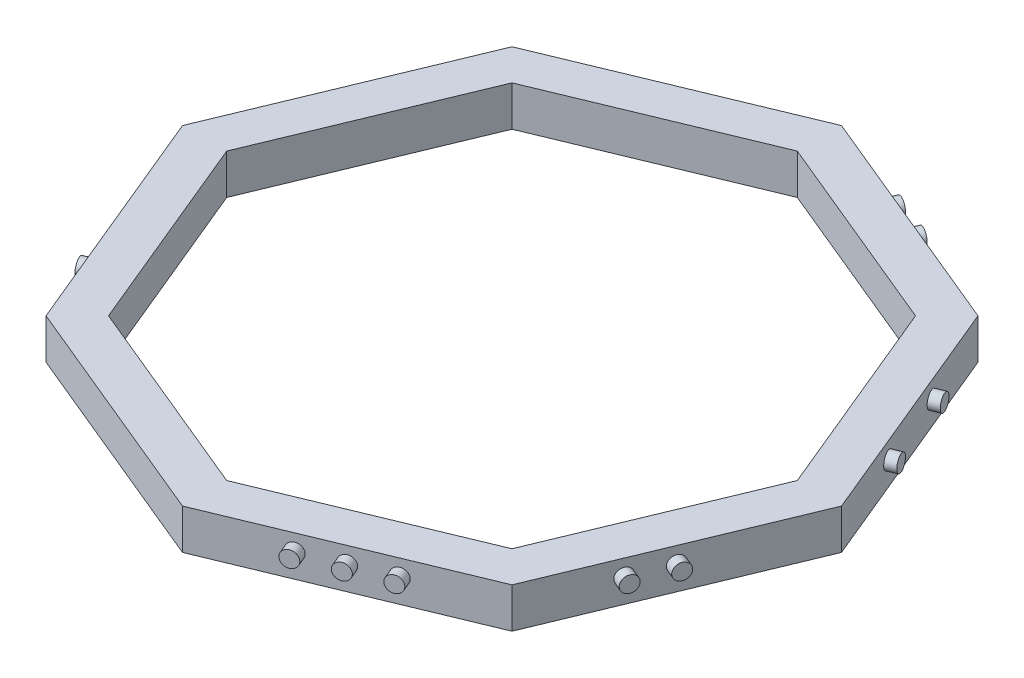
ISO-10303-21;
HEADER;
FILE_DESCRIPTION(('STEP AP214'),'2;1');
FILE_NAME('part.step','',(''),(''),'','','');
FILE_SCHEMA(('AUTOMOTIVE_DESIGN { 1 0 10303 214 1 1 1 1 }'));
ENDSEC;
DATA;
#1=APPLICATION_CONTEXT('core data for automotive mechanical design processes');
#2=APPLICATION_PROTOCOL_DEFINITION('international standard','automotive_design',2000,#1);
#3=PRODUCT_CONTEXT('',#1,'mechanical');
#4=PRODUCT('Part','Part','',(#3));
#5=PRODUCT_RELATED_PRODUCT_CATEGORY('part','',(#4));
#6=PRODUCT_DEFINITION_FORMATION('','',#4);
#7=PRODUCT_DEFINITION_CONTEXT('part definition',#1,'design');
#8=PRODUCT_DEFINITION('design','',#6,#7);
#9=PRODUCT_DEFINITION_SHAPE('','',#8);
#10=(LENGTH_UNIT() NAMED_UNIT(*) SI_UNIT(.MILLI.,.METRE.));
#11=(NAMED_UNIT(*) PLANE_ANGLE_UNIT() SI_UNIT($,.RADIAN.));
#12=(NAMED_UNIT(*) SI_UNIT($,.STERADIAN.) SOLID_ANGLE_UNIT());
#13=UNCERTAINTY_MEASURE_WITH_UNIT(LENGTH_MEASURE(1.E-05),#10,'distance_accuracy_value','');
#14=(GEOMETRIC_REPRESENTATION_CONTEXT(3) GLOBAL_UNCERTAINTY_ASSIGNED_CONTEXT((#13)) GLOBAL_UNIT_ASSIGNED_CONTEXT((#10,
#11,#12)) REPRESENTATION_CONTEXT('',''));
#15=CARTESIAN_POINT('',(0.,0.,0.));
#16=DIRECTION('',(0.,0.,1.));
#17=DIRECTION('',(1.,0.,0.));
#18=AXIS2_PLACEMENT_3D('',#15,#16,#17);
#19=CARTESIAN_POINT('',(28.9913780286488,5.,28.9913780286481));
#20=DIRECTION('',(-0.923879532511291,0.,-0.38268343236508));
#21=DIRECTION('',(-0.38268343236508,0.,0.923879532511291));
#22=AXIS2_PLACEMENT_3D('',#19,#20,#21);
#23=PLANE('',#22);
#24=CARTESIAN_POINT('',(34.9956890143244,3.,14.4956890143238));
#25=DIRECTION('',(-0.923879532511291,0.,-0.38268343236508));
#26=DIRECTION('',(-0.38268343236508,0.,0.923879532511291));
#27=AXIS2_PLACEMENT_3D('',#24,#25,#26);
#28=CIRCLE('',#27,1.);
#29=CARTESIAN_POINT('',(34.6130055819593,3.,15.4195685468351));
#30=VERTEX_POINT('',#29);
#31=EDGE_CURVE('E11',#30,#30,#28,.F.);
#32=ORIENTED_EDGE('',*,*,#31,.F.);
#33=EDGE_LOOP('',(#32));
#34=FACE_BOUND('',#33,.T.);
#35=CARTESIAN_POINT('',(33.082271852499,3.,19.1150866768803));
#36=DIRECTION('',(-0.923879532511291,0.,-0.38268343236508));
#37=DIRECTION('',(-0.38268343236508,0.,0.923879532511291));
#38=AXIS2_PLACEMENT_3D('',#35,#36,#37);
#39=CIRCLE('',#38,1.);
#40=CARTESIAN_POINT('',(32.6995884201339,3.,20.0389662093916));
#41=VERTEX_POINT('',#40);
#42=EDGE_CURVE('E40',#41,#41,#39,.F.);
#43=ORIENTED_EDGE('',*,*,#42,.F.);
#44=EDGE_LOOP('',(#43));
#45=FACE_BOUND('',#44,.T.);
#46=DIRECTION('',(0.38268343236508,0.,-0.923879532511291));
#47=VECTOR('',#46,1.);
#48=CARTESIAN_POINT('',(28.9913780286488,0.,28.9913780286481));
#49=LINE('',#48,#47);
#50=CARTESIAN_POINT('',(28.9913780286488,0.,28.9913780286481));
#51=VERTEX_POINT('',#50);
#52=CARTESIAN_POINT('',(41.,0.,-4.48023070960939E-13));
#53=VERTEX_POINT('',#52);
#54=EDGE_CURVE('E205',#51,#53,#49,.T.);
#55=ORIENTED_EDGE('',*,*,#54,.T.);
#56=DIRECTION('',(0.,-1.,0.));
#57=VECTOR('',#56,1.);
#58=CARTESIAN_POINT('',(41.,5.,-4.48023070960939E-13));
#59=LINE('',#58,#57);
#60=CARTESIAN_POINT('',(41.,5.,-4.48023070960939E-13));
#61=VERTEX_POINT('',#60);
#62=EDGE_CURVE('E271',#61,#53,#59,.T.);
#63=ORIENTED_EDGE('',*,*,#62,.F.);
#64=DIRECTION('',(0.38268343236508,0.,-0.923879532511291));
#65=VECTOR('',#64,1.);
#66=CARTESIAN_POINT('',(28.9913780286488,5.,28.9913780286481));
#67=LINE('',#66,#65);
#68=CARTESIAN_POINT('',(28.9913780286488,5.,28.9913780286481));
#69=VERTEX_POINT('',#68);
#70=EDGE_CURVE('E217',#69,#61,#67,.T.);
#71=ORIENTED_EDGE('',*,*,#70,.F.);
#72=DIRECTION('',(0.,-1.,0.));
#73=VECTOR('',#72,1.);
#74=CARTESIAN_POINT('',(28.9913780286488,5.,28.9913780286481));
#75=LINE('',#74,#73);
#76=EDGE_CURVE('E235',#69,#51,#75,.T.);
#77=ORIENTED_EDGE('',*,*,#76,.T.);
#78=EDGE_LOOP('',(#55,#63,#71,#77));
#79=FACE_BOUND('',#78,.T.);
#80=ADVANCED_FACE('F33',(#34,#45,#79),#23,.F.);
#81=CARTESIAN_POINT('',(41.,5.,-4.48023070960939E-13));
#82=DIRECTION('',(-0.923879532511283,0.,0.3826834323651));
#83=DIRECTION('',(0.3826834323651,0.,0.923879532511283));
#84=AXIS2_PLACEMENT_3D('',#81,#82,#83);
#85=PLANE('',#84);
#86=CARTESIAN_POINT('',(33.0822718524986,3.,-19.115086676881));
#87=DIRECTION('',(-0.923879532511283,0.,0.3826834323651));
#88=DIRECTION('',(0.3826834323651,0.,0.923879532511283));
#89=AXIS2_PLACEMENT_3D('',#86,#87,#88);
#90=CIRCLE('',#89,1.);
#91=CARTESIAN_POINT('',(33.4649552848637,3.,-18.1912071443697));
#92=VERTEX_POINT('',#91);
#93=EDGE_CURVE('E301',#92,#92,#90,.F.);
#94=ORIENTED_EDGE('',*,*,#93,.F.);
#95=EDGE_LOOP('',(#94));
#96=FACE_BOUND('',#95,.T.);
#97=CARTESIAN_POINT('',(36.9091061761496,3.,-9.8762913517682));
#98=DIRECTION('',(-0.923879532511283,0.,0.3826834323651));
#99=DIRECTION('',(0.3826834323651,0.,0.923879532511283));
#100=AXIS2_PLACEMENT_3D('',#97,#98,#99);
#101=CIRCLE('',#100,1.);
#102=CARTESIAN_POINT('',(37.2917896085147,3.,-8.95241181925691));
#103=VERTEX_POINT('',#102);
#104=EDGE_CURVE('E298',#103,#103,#101,.F.);
#105=ORIENTED_EDGE('',*,*,#104,.F.);
#106=EDGE_LOOP('',(#105));
#107=FACE_BOUND('',#106,.T.);
#108=DIRECTION('',(-0.3826834323651,0.,-0.923879532511283));
#109=VECTOR('',#108,1.);
#110=CARTESIAN_POINT('',(41.,0.,-4.48023070960939E-13));
#111=LINE('',#110,#109);
#112=CARTESIAN_POINT('',(28.9913780286481,0.,-28.9913780286488));
#113=VERTEX_POINT('',#112);
#114=EDGE_CURVE('E238',#53,#113,#111,.T.);
#115=ORIENTED_EDGE('',*,*,#114,.T.);
#116=DIRECTION('',(0.,-1.,0.));
#117=VECTOR('',#116,1.);
#118=CARTESIAN_POINT('',(28.9913780286481,5.,-28.9913780286488));
#119=LINE('',#118,#117);
#120=CARTESIAN_POINT('',(28.9913780286481,5.,-28.9913780286488));
#121=VERTEX_POINT('',#120);
#122=EDGE_CURVE('E268',#121,#113,#119,.T.);
#123=ORIENTED_EDGE('',*,*,#122,.F.);
#124=DIRECTION('',(-0.3826834323651,0.,-0.923879532511283));
#125=VECTOR('',#124,1.);
#126=CARTESIAN_POINT('',(41.,5.,-4.48023070960939E-13));
#127=LINE('',#126,#125);
#128=EDGE_CURVE('E220',#61,#121,#127,.T.);
#129=ORIENTED_EDGE('',*,*,#128,.F.);
#130=ORIENTED_EDGE('',*,*,#62,.T.);
#131=EDGE_LOOP('',(#115,#123,#129,#130));
#132=FACE_BOUND('',#131,.T.);
#133=ADVANCED_FACE('F310',(#96,#107,#132),#85,.F.);
#134=CARTESIAN_POINT('',(28.9913780286481,5.,-28.9913780286488));
#135=DIRECTION('',(-0.38268343236508,0.,0.923879532511291));
#136=DIRECTION('',(0.923879532511291,0.,0.38268343236508));
#137=AXIS2_PLACEMENT_3D('',#134,#135,#136);
#138=PLANE('',#137);
#139=CARTESIAN_POINT('',(9.87629135176739,3.,-36.9091061761498));
#140=DIRECTION('',(-0.38268343236508,0.,0.923879532511291));
#141=DIRECTION('',(0.923879532511291,0.,0.38268343236508));
#142=AXIS2_PLACEMENT_3D('',#139,#140,#141);
#143=CIRCLE('',#142,0.999999999999998);
#144=CARTESIAN_POINT('',(10.8001708842787,3.,-36.5264227437847));
#145=VERTEX_POINT('',#144);
#146=EDGE_CURVE('E295',#145,#145,#143,.F.);
#147=ORIENTED_EDGE('',*,*,#146,.F.);
#148=EDGE_LOOP('',(#147));
#149=FACE_BOUND('',#148,.T.);
#150=CARTESIAN_POINT('',(14.4956890143238,3.,-34.9956890143244));
#151=DIRECTION('',(-0.38268343236508,0.,0.923879532511291));
#152=DIRECTION('',(0.923879532511291,0.,0.38268343236508));
#153=AXIS2_PLACEMENT_3D('',#150,#151,#152);
#154=CIRCLE('',#153,1.);
#155=CARTESIAN_POINT('',(15.4195685468351,3.,-34.6130055819593));
#156=VERTEX_POINT('',#155);
#157=EDGE_CURVE('E292',#156,#156,#154,.F.);
#158=ORIENTED_EDGE('',*,*,#157,.F.);
#159=EDGE_LOOP('',(#158));
#160=FACE_BOUND('',#159,.T.);
#161=DIRECTION('',(-0.923879532511291,0.,-0.38268343236508));
#162=VECTOR('',#161,1.);
#163=CARTESIAN_POINT('',(28.9913780286481,0.,-28.9913780286488));
#164=LINE('',#163,#162);
#165=CARTESIAN_POINT('',(-4.51771650624012E-13,0.,-41.));
#166=VERTEX_POINT('',#165);
#167=EDGE_CURVE('E240',#113,#166,#164,.T.);
#168=ORIENTED_EDGE('',*,*,#167,.T.);
#169=DIRECTION('',(0.,-1.,0.));
#170=VECTOR('',#169,1.);
#171=CARTESIAN_POINT('',(-4.51771650624012E-13,5.,-41.));
#172=LINE('',#171,#170);
#173=CARTESIAN_POINT('',(-4.51771650624012E-13,5.,-41.));
#174=VERTEX_POINT('',#173);
#175=EDGE_CURVE('E265',#174,#166,#172,.T.);
#176=ORIENTED_EDGE('',*,*,#175,.F.);
#177=DIRECTION('',(-0.923879532511291,0.,-0.38268343236508));
#178=VECTOR('',#177,1.);
#179=CARTESIAN_POINT('',(28.9913780286481,5.,-28.9913780286488));
#180=LINE('',#179,#178);
#181=EDGE_CURVE('E223',#121,#174,#180,.T.);
#182=ORIENTED_EDGE('',*,*,#181,.F.);
#183=ORIENTED_EDGE('',*,*,#122,.T.);
#184=EDGE_LOOP('',(#168,#176,#182,#183));
#185=FACE_BOUND('',#184,.T.);
#186=ADVANCED_FACE('F348',(#149,#160,#185),#138,.F.);
#187=CARTESIAN_POINT('',(-4.51771650624012E-13,5.,-41.));
#188=DIRECTION('',(0.3826834323651,0.,0.923879532511283));
#189=DIRECTION('',(0.923879532511283,0.,-0.3826834323651));
#190=AXIS2_PLACEMENT_3D('',#187,#188,#189);
#191=PLANE('',#190);
#192=CARTESIAN_POINT('',(-9.8762913517682,3.,-36.9091061761496));
#193=DIRECTION('',(0.3826834323651,0.,0.923879532511283));
#194=DIRECTION('',(0.923879532511283,0.,-0.3826834323651));
#195=AXIS2_PLACEMENT_3D('',#192,#193,#194);
#196=CIRCLE('',#195,1.);
#197=CARTESIAN_POINT('',(-8.95241181925692,3.,-37.2917896085147));
#198=VERTEX_POINT('',#197);
#199=EDGE_CURVE('E289',#198,#198,#196,.F.);
#200=ORIENTED_EDGE('',*,*,#199,.F.);
#201=EDGE_LOOP('',(#200));
#202=FACE_BOUND('',#201,.T.);
#203=DIRECTION('',(-0.923879532511283,0.,0.3826834323651));
#204=VECTOR('',#203,1.);
#205=CARTESIAN_POINT('',(-4.51771650624012E-13,0.,-41.));
#206=LINE('',#205,#204);
#207=CARTESIAN_POINT('',(-28.9913780286488,0.,-28.9913780286481));
#208=VERTEX_POINT('',#207);
#209=EDGE_CURVE('E242',#166,#208,#206,.T.);
#210=ORIENTED_EDGE('',*,*,#209,.T.);
#211=DIRECTION('',(0.,-1.,0.));
#212=VECTOR('',#211,1.);
#213=CARTESIAN_POINT('',(-28.9913780286488,5.,-28.9913780286481));
#214=LINE('',#213,#212);
#215=CARTESIAN_POINT('',(-28.9913780286488,5.,-28.9913780286481));
#216=VERTEX_POINT('',#215);
#217=EDGE_CURVE('E262',#216,#208,#214,.T.);
#218=ORIENTED_EDGE('',*,*,#217,.F.);
#219=DIRECTION('',(-0.923879532511283,0.,0.3826834323651));
#220=VECTOR('',#219,1.);
#221=CARTESIAN_POINT('',(-4.51771650624012E-13,5.,-41.));
#222=LINE('',#221,#220);
#223=EDGE_CURVE('E225',#174,#216,#222,.T.);
#224=ORIENTED_EDGE('',*,*,#223,.F.);
#225=ORIENTED_EDGE('',*,*,#175,.T.);
#226=EDGE_LOOP('',(#210,#218,#224,#225));
#227=FACE_BOUND('',#226,.T.);
#228=ADVANCED_FACE('F345',(#202,#227),#191,.F.);
#229=CARTESIAN_POINT('',(-28.9913780286488,5.,-28.9913780286481));
#230=DIRECTION('',(0.923879532511291,0.,0.38268343236508));
#231=DIRECTION('',(0.38268343236508,0.,-0.923879532511291));
#232=AXIS2_PLACEMENT_3D('',#229,#230,#231);
#233=PLANE('',#232);
#234=CARTESIAN_POINT('',(-34.9956890143244,3.,-14.4956890143239));
#235=DIRECTION('',(0.923879532511291,0.,0.38268343236508));
#236=DIRECTION('',(0.38268343236508,0.,-0.923879532511291));
#237=AXIS2_PLACEMENT_3D('',#234,#235,#236);
#238=CIRCLE('',#237,0.999999999999998);
#239=CARTESIAN_POINT('',(-34.6130055819593,3.,-15.4195685468351));
#240=VERTEX_POINT('',#239);
#241=EDGE_CURVE('E286',#240,#240,#238,.F.);
#242=ORIENTED_EDGE('',*,*,#241,.F.);
#243=EDGE_LOOP('',(#242));
#244=FACE_BOUND('',#243,.T.);
#245=DIRECTION('',(-0.38268343236508,0.,0.923879532511291));
#246=VECTOR('',#245,1.);
#247=CARTESIAN_POINT('',(-28.9913780286488,0.,-28.9913780286481));
#248=LINE('',#247,#246);
#249=CARTESIAN_POINT('',(-41.,0.,4.3736829323662E-13));
#250=VERTEX_POINT('',#249);
#251=EDGE_CURVE('E244',#208,#250,#248,.T.);
#252=ORIENTED_EDGE('',*,*,#251,.T.);
#253=DIRECTION('',(0.,-1.,0.));
#254=VECTOR('',#253,1.);
#255=CARTESIAN_POINT('',(-41.,5.,4.3736829323662E-13));
#256=LINE('',#255,#254);
#257=CARTESIAN_POINT('',(-41.,5.,4.3736829323662E-13));
#258=VERTEX_POINT('',#257);
#259=EDGE_CURVE('E259',#258,#250,#256,.T.);
#260=ORIENTED_EDGE('',*,*,#259,.F.);
#261=DIRECTION('',(-0.38268343236508,0.,0.923879532511291));
#262=VECTOR('',#261,1.);
#263=CARTESIAN_POINT('',(-28.9913780286488,5.,-28.9913780286481));
#264=LINE('',#263,#262);
#265=EDGE_CURVE('E227',#216,#258,#264,.T.);
#266=ORIENTED_EDGE('',*,*,#265,.F.);
#267=ORIENTED_EDGE('',*,*,#217,.T.);
#268=EDGE_LOOP('',(#252,#260,#266,#267));
#269=FACE_BOUND('',#268,.T.);
#270=ADVANCED_FACE('F341',(#244,#269),#233,.F.);
#271=CARTESIAN_POINT('',(-41.,5.,4.3736829323662E-13));
#272=DIRECTION('',(0.923879532511283,0.,-0.3826834323651));
#273=DIRECTION('',(-0.3826834323651,0.,-0.923879532511283));
#274=AXIS2_PLACEMENT_3D('',#271,#272,#273);
#275=PLANE('',#274);
#276=CARTESIAN_POINT('',(-33.0822718524986,3.,19.115086676881));
#277=DIRECTION('',(0.923879532511283,0.,-0.3826834323651));
#278=DIRECTION('',(-0.3826834323651,0.,-0.923879532511283));
#279=AXIS2_PLACEMENT_3D('',#276,#277,#278);
#280=CIRCLE('',#279,1.);
#281=CARTESIAN_POINT('',(-33.4649552848637,3.,18.1912071443697));
#282=VERTEX_POINT('',#281);
#283=EDGE_CURVE('E283',#282,#282,#280,.F.);
#284=ORIENTED_EDGE('',*,*,#283,.F.);
#285=EDGE_LOOP('',(#284));
#286=FACE_BOUND('',#285,.T.);
#287=DIRECTION('',(0.3826834323651,0.,0.923879532511283));
#288=VECTOR('',#287,1.);
#289=CARTESIAN_POINT('',(-41.,0.,4.3736829323662E-13));
#290=LINE('',#289,#288);
#291=CARTESIAN_POINT('',(-28.9913780286481,0.,28.9913780286488));
#292=VERTEX_POINT('',#291);
#293=EDGE_CURVE('E246',#250,#292,#290,.T.);
#294=ORIENTED_EDGE('',*,*,#293,.T.);
#295=DIRECTION('',(0.,-1.,0.));
#296=VECTOR('',#295,1.);
#297=CARTESIAN_POINT('',(-28.9913780286481,5.,28.9913780286488));
#298=LINE('',#297,#296);
#299=CARTESIAN_POINT('',(-28.9913780286481,5.,28.9913780286488));
#300=VERTEX_POINT('',#299);
#301=EDGE_CURVE('E256',#300,#292,#298,.T.);
#302=ORIENTED_EDGE('',*,*,#301,.F.);
#303=DIRECTION('',(0.3826834323651,0.,0.923879532511283));
#304=VECTOR('',#303,1.);
#305=CARTESIAN_POINT('',(-41.,5.,4.3736829323662E-13));
#306=LINE('',#305,#304);
#307=EDGE_CURVE('E229',#258,#300,#306,.T.);
#308=ORIENTED_EDGE('',*,*,#307,.F.);
#309=ORIENTED_EDGE('',*,*,#259,.T.);
#310=EDGE_LOOP('',(#294,#302,#308,#309));
#311=FACE_BOUND('',#310,.T.);
#312=ADVANCED_FACE('F336',(#286,#311),#275,.F.);
#313=CARTESIAN_POINT('',(-28.9913780286481,5.,28.9913780286488));
#314=DIRECTION('',(0.382683432365079,0.,-0.923879532511291));
#315=DIRECTION('',(-0.923879532511291,0.,-0.382683432365079));
#316=AXIS2_PLACEMENT_3D('',#313,#314,#315);
#317=PLANE('',#316);
#318=DIRECTION('',(0.923879532511291,0.,0.382683432365079));
#319=VECTOR('',#318,1.);
#320=CARTESIAN_POINT('',(-28.9913780286481,0.,28.9913780286488));
#321=LINE('',#320,#319);
#322=CARTESIAN_POINT('',(4.40747933146162E-13,0.,41.));
#323=VERTEX_POINT('',#322);
#324=EDGE_CURVE('E248',#292,#323,#321,.T.);
#325=ORIENTED_EDGE('',*,*,#324,.T.);
#326=DIRECTION('',(0.,-1.,0.));
#327=VECTOR('',#326,1.);
#328=CARTESIAN_POINT('',(4.40747933146162E-13,5.,41.));
#329=LINE('',#328,#327);
#330=CARTESIAN_POINT('',(4.40747933146162E-13,5.,41.));
#331=VERTEX_POINT('',#330);
#332=EDGE_CURVE('E253',#331,#323,#329,.T.);
#333=ORIENTED_EDGE('',*,*,#332,.F.);
#334=DIRECTION('',(0.923879532511291,0.,0.382683432365079));
#335=VECTOR('',#334,1.);
#336=CARTESIAN_POINT('',(-28.9913780286481,5.,28.9913780286488));
#337=LINE('',#336,#335);
#338=EDGE_CURVE('E231',#300,#331,#337,.T.);
#339=ORIENTED_EDGE('',*,*,#338,.F.);
#340=ORIENTED_EDGE('',*,*,#301,.T.);
#341=EDGE_LOOP('',(#325,#333,#339,#340));
#342=FACE_BOUND('',#341,.T.);
#343=ADVANCED_FACE('F331',(#342),#317,.F.);
#344=CARTESIAN_POINT('',(4.40747933146162E-13,5.,41.));
#345=DIRECTION('',(-0.3826834323651,0.,-0.923879532511283));
#346=DIRECTION('',(-0.923879532511283,0.,0.3826834323651));
#347=AXIS2_PLACEMENT_3D('',#344,#345,#346);
#348=PLANE('',#347);
#349=CARTESIAN_POINT('',(14.4956890143246,3.,34.9956890143241));
#350=DIRECTION('',(-0.3826834323651,0.,-0.923879532511283));
#351=DIRECTION('',(-0.923879532511283,0.,0.3826834323651));
#352=AXIS2_PLACEMENT_3D('',#349,#350,#351);
#353=CIRCLE('',#352,1.);
#354=CARTESIAN_POINT('',(13.5718094818133,3.,35.3783724466892));
#355=VERTEX_POINT('',#354);
#356=EDGE_CURVE('E280',#355,#355,#353,.F.);
#357=ORIENTED_EDGE('',*,*,#356,.F.);
#358=EDGE_LOOP('',(#357));
#359=FACE_BOUND('',#358,.T.);
#360=CARTESIAN_POINT('',(9.87629135176818,3.,36.9091061761496));
#361=DIRECTION('',(-0.3826834323651,0.,-0.923879532511283));
#362=DIRECTION('',(-0.923879532511283,0.,0.3826834323651));
#363=AXIS2_PLACEMENT_3D('',#360,#361,#362);
#364=CIRCLE('',#363,1.);
#365=CARTESIAN_POINT('',(8.9524118192569,3.,37.2917896085147));
#366=VERTEX_POINT('',#365);
#367=EDGE_CURVE('E277',#366,#366,#364,.F.);
#368=ORIENTED_EDGE('',*,*,#367,.F.);
#369=EDGE_LOOP('',(#368));
#370=FACE_BOUND('',#369,.T.);
#371=CARTESIAN_POINT('',(19.115086676881,3.,33.0822718524986));
#372=DIRECTION('',(-0.3826834323651,0.,-0.923879532511283));
#373=DIRECTION('',(-0.923879532511283,0.,0.3826834323651));
#374=AXIS2_PLACEMENT_3D('',#371,#372,#373);
#375=CIRCLE('',#374,1.);
#376=CARTESIAN_POINT('',(18.1912071443697,3.,33.4649552848637));
#377=VERTEX_POINT('',#376);
#378=EDGE_CURVE('E274',#377,#377,#375,.F.);
#379=ORIENTED_EDGE('',*,*,#378,.F.);
#380=EDGE_LOOP('',(#379));
#381=FACE_BOUND('',#380,.T.);
#382=DIRECTION('',(0.923879532511283,0.,-0.3826834323651));
#383=VECTOR('',#382,1.);
#384=CARTESIAN_POINT('',(4.40747933146162E-13,0.,41.));
#385=LINE('',#384,#383);
#386=EDGE_CURVE('E221',#323,#51,#385,.T.);
#387=ORIENTED_EDGE('',*,*,#386,.T.);
#388=ORIENTED_EDGE('',*,*,#76,.F.);
#389=DIRECTION('',(0.923879532511283,0.,-0.3826834323651));
#390=VECTOR('',#389,1.);
#391=CARTESIAN_POINT('',(4.40747933146162E-13,5.,41.));
#392=LINE('',#391,#390);
#393=EDGE_CURVE('E233',#331,#69,#392,.T.);
#394=ORIENTED_EDGE('',*,*,#393,.F.);
#395=ORIENTED_EDGE('',*,*,#332,.T.);
#396=EDGE_LOOP('',(#387,#388,#394,#395));
#397=FACE_BOUND('',#396,.T.);
#398=ADVANCED_FACE('F329',(#359,#370,#381,#397),#348,.F.);
#399=CARTESIAN_POINT('',(0.,5.,0.));
#400=DIRECTION('',(0.,1.,0.));
#401=DIRECTION('',(0.,0.,1.));
#402=AXIS2_PLACEMENT_3D('',#399,#400,#401);
#403=PLANE('',#402);
#404=DIRECTION('',(0.382683432365079,0.,-0.923879532511291));
#405=VECTOR('',#404,1.);
#406=CARTESIAN_POINT('',(25.1022907321227,5.,25.1022907321221));
#407=LINE('',#406,#405);
#408=CARTESIAN_POINT('',(25.1022907321227,5.,25.1022907321221));
#409=VERTEX_POINT('',#408);
#410=CARTESIAN_POINT('',(35.5,5.,-4.1286418728248E-13));
#411=VERTEX_POINT('',#410);
#412=EDGE_CURVE('E47',#409,#411,#407,.T.);
#413=ORIENTED_EDGE('',*,*,#412,.F.);
#414=DIRECTION('',(0.923879532511282,0.,-0.3826834323651));
#415=VECTOR('',#414,1.);
#416=CARTESIAN_POINT('',(4.1527056440477E-13,5.,35.5));
#417=LINE('',#416,#415);
#418=CARTESIAN_POINT('',(4.1527056440477E-13,5.,35.5));
#419=VERTEX_POINT('',#418);
#420=EDGE_CURVE('E164',#419,#409,#417,.T.);
#421=ORIENTED_EDGE('',*,*,#420,.F.);
#422=DIRECTION('',(0.923879532511291,0.,0.382683432365079));
#423=VECTOR('',#422,1.);
#424=CARTESIAN_POINT('',(-25.1022907321221,5.,25.1022907321227));
#425=LINE('',#424,#423);
#426=CARTESIAN_POINT('',(-25.1022907321221,5.,25.1022907321227));
#427=VERTEX_POINT('',#426);
#428=EDGE_CURVE('E167',#427,#419,#425,.T.);
#429=ORIENTED_EDGE('',*,*,#428,.F.);
#430=DIRECTION('',(0.3826834323651,0.,0.923879532511282));
#431=VECTOR('',#430,1.);
#432=CARTESIAN_POINT('',(-35.5,5.,4.16311159156231E-13));
#433=LINE('',#432,#431);
#434=CARTESIAN_POINT('',(-35.5,5.,4.16311159156231E-13));
#435=VERTEX_POINT('',#434);
#436=EDGE_CURVE('E198',#435,#427,#433,.T.);
#437=ORIENTED_EDGE('',*,*,#436,.F.);
#438=DIRECTION('',(-0.382683432365079,0.,0.923879532511291));
#439=VECTOR('',#438,1.);
#440=CARTESIAN_POINT('',(-25.1022907321227,5.,-25.1022907321221));
#441=LINE('',#440,#439);
#442=CARTESIAN_POINT('',(-25.1022907321227,5.,-25.1022907321221));
#443=VERTEX_POINT('',#442);
#444=EDGE_CURVE('E195',#443,#435,#441,.T.);
#445=ORIENTED_EDGE('',*,*,#444,.F.);
#446=DIRECTION('',(-0.923879532511282,0.,0.3826834323651));
#447=VECTOR('',#446,1.);
#448=CARTESIAN_POINT('',(-4.16334381368631E-13,5.,-35.5));
#449=LINE('',#448,#447);
#450=CARTESIAN_POINT('',(-4.16334381368631E-13,5.,-35.5));
#451=VERTEX_POINT('',#450);
#452=EDGE_CURVE('E192',#451,#443,#449,.T.);
#453=ORIENTED_EDGE('',*,*,#452,.F.);
#454=DIRECTION('',(-0.923879532511291,0.,-0.382683432365079));
#455=VECTOR('',#454,1.);
#456=CARTESIAN_POINT('',(25.1022907321221,5.,-25.1022907321227));
#457=LINE('',#456,#455);
#458=CARTESIAN_POINT('',(25.1022907321221,5.,-25.1022907321227));
#459=VERTEX_POINT('',#458);
#460=EDGE_CURVE('E189',#459,#451,#457,.T.);
#461=ORIENTED_EDGE('',*,*,#460,.F.);
#462=DIRECTION('',(-0.3826834323651,0.,-0.923879532511282));
#463=VECTOR('',#462,1.);
#464=CARTESIAN_POINT('',(35.5,5.,-4.13972482836576E-13));
#465=LINE('',#464,#463);
#466=EDGE_CURVE('E187',#411,#459,#465,.T.);
#467=ORIENTED_EDGE('',*,*,#466,.F.);
#468=EDGE_LOOP('',(#413,#421,#429,#437,#445,#453,#461,#467));
#469=FACE_BOUND('',#468,.T.);
#470=ORIENTED_EDGE('',*,*,#70,.T.);
#471=ORIENTED_EDGE('',*,*,#128,.T.);
#472=ORIENTED_EDGE('',*,*,#181,.T.);
#473=ORIENTED_EDGE('',*,*,#223,.T.);
#474=ORIENTED_EDGE('',*,*,#265,.T.);
#475=ORIENTED_EDGE('',*,*,#307,.T.);
#476=ORIENTED_EDGE('',*,*,#338,.T.);
#477=ORIENTED_EDGE('',*,*,#393,.T.);
#478=EDGE_LOOP('',(#470,#471,#472,#473,#474,#475,#476,#477));
#479=FACE_BOUND('',#478,.T.);
#480=ADVANCED_FACE('F324',(#469,#479),#403,.T.);
#481=CARTESIAN_POINT('',(0.,0.,0.));
#482=DIRECTION('',(0.,1.,0.));
#483=DIRECTION('',(0.,0.,1.));
#484=AXIS2_PLACEMENT_3D('',#481,#482,#483);
#485=PLANE('',#484);
#486=DIRECTION('',(0.923879532511282,0.,-0.3826834323651));
#487=VECTOR('',#486,1.);
#488=CARTESIAN_POINT('',(4.1527056440477E-13,0.,35.5));
#489=LINE('',#488,#487);
#490=CARTESIAN_POINT('',(4.1527056440477E-13,0.,35.5));
#491=VERTEX_POINT('',#490);
#492=CARTESIAN_POINT('',(25.1022907321227,0.,25.1022907321221));
#493=VERTEX_POINT('',#492);
#494=EDGE_CURVE('E153',#491,#493,#489,.T.);
#495=ORIENTED_EDGE('',*,*,#494,.T.);
#496=DIRECTION('',(0.382683432365079,0.,-0.923879532511291));
#497=VECTOR('',#496,1.);
#498=CARTESIAN_POINT('',(25.1022907321227,0.,25.1022907321221));
#499=LINE('',#498,#497);
#500=CARTESIAN_POINT('',(35.5,0.,-4.13972482836576E-13));
#501=VERTEX_POINT('',#500);
#502=EDGE_CURVE('E147',#493,#501,#499,.T.);
#503=ORIENTED_EDGE('',*,*,#502,.T.);
#504=DIRECTION('',(-0.3826834323651,0.,-0.923879532511282));
#505=VECTOR('',#504,1.);
#506=CARTESIAN_POINT('',(35.5,0.,-4.13972482836576E-13));
#507=LINE('',#506,#505);
#508=CARTESIAN_POINT('',(25.1022907321221,0.,-25.1022907321227));
#509=VERTEX_POINT('',#508);
#510=EDGE_CURVE('E156',#501,#509,#507,.T.);
#511=ORIENTED_EDGE('',*,*,#510,.T.);
#512=DIRECTION('',(-0.923879532511291,0.,-0.382683432365079));
#513=VECTOR('',#512,1.);
#514=CARTESIAN_POINT('',(25.1022907321221,0.,-25.1022907321227));
#515=LINE('',#514,#513);
#516=CARTESIAN_POINT('',(-4.16334381368631E-13,0.,-35.5));
#517=VERTEX_POINT('',#516);
#518=EDGE_CURVE('E55',#509,#517,#515,.T.);
#519=ORIENTED_EDGE('',*,*,#518,.T.);
#520=DIRECTION('',(-0.923879532511282,0.,0.3826834323651));
#521=VECTOR('',#520,1.);
#522=CARTESIAN_POINT('',(-4.16334381368631E-13,0.,-35.5));
#523=LINE('',#522,#521);
#524=CARTESIAN_POINT('',(-25.1022907321227,0.,-25.1022907321221));
#525=VERTEX_POINT('',#524);
#526=EDGE_CURVE('E174',#517,#525,#523,.T.);
#527=ORIENTED_EDGE('',*,*,#526,.T.);
#528=DIRECTION('',(-0.382683432365079,0.,0.923879532511291));
#529=VECTOR('',#528,1.);
#530=CARTESIAN_POINT('',(-25.1022907321227,0.,-25.1022907321221));
#531=LINE('',#530,#529);
#532=CARTESIAN_POINT('',(-35.5,0.,4.16311159156231E-13));
#533=VERTEX_POINT('',#532);
#534=EDGE_CURVE('E177',#525,#533,#531,.T.);
#535=ORIENTED_EDGE('',*,*,#534,.T.);
#536=DIRECTION('',(0.3826834323651,0.,0.923879532511282));
#537=VECTOR('',#536,1.);
#538=CARTESIAN_POINT('',(-35.5,0.,4.16311159156231E-13));
#539=LINE('',#538,#537);
#540=CARTESIAN_POINT('',(-25.1022907321221,0.,25.1022907321227));
#541=VERTEX_POINT('',#540);
#542=EDGE_CURVE('E180',#533,#541,#539,.T.);
#543=ORIENTED_EDGE('',*,*,#542,.T.);
#544=DIRECTION('',(0.923879532511291,0.,0.382683432365079));
#545=VECTOR('',#544,1.);
#546=CARTESIAN_POINT('',(-25.1022907321221,0.,25.1022907321227));
#547=LINE('',#546,#545);
#548=EDGE_CURVE('E183',#541,#491,#547,.T.);
#549=ORIENTED_EDGE('',*,*,#548,.T.);
#550=EDGE_LOOP('',(#495,#503,#511,#519,#527,#535,#543,#549));
#551=FACE_BOUND('',#550,.T.);
#552=ORIENTED_EDGE('',*,*,#54,.F.);
#553=ORIENTED_EDGE('',*,*,#386,.F.);
#554=ORIENTED_EDGE('',*,*,#324,.F.);
#555=ORIENTED_EDGE('',*,*,#293,.F.);
#556=ORIENTED_EDGE('',*,*,#251,.F.);
#557=ORIENTED_EDGE('',*,*,#209,.F.);
#558=ORIENTED_EDGE('',*,*,#167,.F.);
#559=ORIENTED_EDGE('',*,*,#114,.F.);
#560=EDGE_LOOP('',(#552,#553,#554,#555,#556,#557,#558,#559));
#561=FACE_BOUND('',#560,.T.);
#562=ADVANCED_FACE('F160',(#551,#561),#485,.F.);
#563=CARTESIAN_POINT('',(25.1022907321227,0.,25.1022907321221));
#564=DIRECTION('',(0.923879532511291,0.,0.382683432365079));
#565=DIRECTION('',(0.382683432365079,0.,-0.923879532511291));
#566=AXIS2_PLACEMENT_3D('',#563,#564,#565);
#567=PLANE('',#566);
#568=ORIENTED_EDGE('',*,*,#412,.T.);
#569=DIRECTION('',(0.,1.,0.));
#570=VECTOR('',#569,1.);
#571=CARTESIAN_POINT('',(35.5,0.,-4.13972482836576E-13));
#572=LINE('',#571,#570);
#573=EDGE_CURVE('E143',#501,#411,#572,.T.);
#574=ORIENTED_EDGE('',*,*,#573,.F.);
#575=ORIENTED_EDGE('',*,*,#502,.F.);
#576=DIRECTION('',(0.,1.,0.));
#577=VECTOR('',#576,1.);
#578=CARTESIAN_POINT('',(25.1022907321227,0.,25.1022907321221));
#579=LINE('',#578,#577);
#580=EDGE_CURVE('E203',#493,#409,#579,.T.);
#581=ORIENTED_EDGE('',*,*,#580,.T.);
#582=EDGE_LOOP('',(#568,#574,#575,#581));
#583=FACE_BOUND('',#582,.T.);
#584=ADVANCED_FACE('F145',(#583),#567,.F.);
#585=CARTESIAN_POINT('',(4.1527056440477E-13,0.,35.5));
#586=DIRECTION('',(0.3826834323651,0.,0.923879532511282));
#587=DIRECTION('',(0.923879532511283,0.,-0.382683432365101));
#588=AXIS2_PLACEMENT_3D('',#585,#586,#587);
#589=PLANE('',#588);
#590=ORIENTED_EDGE('',*,*,#420,.T.);
#591=ORIENTED_EDGE('',*,*,#580,.F.);
#592=ORIENTED_EDGE('',*,*,#494,.F.);
#593=DIRECTION('',(0.,1.,0.));
#594=VECTOR('',#593,1.);
#595=CARTESIAN_POINT('',(4.1527056440477E-13,0.,35.5));
#596=LINE('',#595,#594);
#597=EDGE_CURVE('E206',#491,#419,#596,.T.);
#598=ORIENTED_EDGE('',*,*,#597,.T.);
#599=EDGE_LOOP('',(#590,#591,#592,#598));
#600=FACE_BOUND('',#599,.T.);
#601=ADVANCED_FACE('F380',(#600),#589,.F.);
#602=CARTESIAN_POINT('',(-25.1022907321221,0.,25.1022907321227));
#603=DIRECTION('',(-0.382683432365079,0.,0.923879532511291));
#604=DIRECTION('',(0.923879532511291,0.,0.382683432365079));
#605=AXIS2_PLACEMENT_3D('',#602,#603,#604);
#606=PLANE('',#605);
#607=ORIENTED_EDGE('',*,*,#428,.T.);
#608=ORIENTED_EDGE('',*,*,#597,.F.);
#609=ORIENTED_EDGE('',*,*,#548,.F.);
#610=DIRECTION('',(0.,1.,0.));
#611=VECTOR('',#610,1.);
#612=CARTESIAN_POINT('',(-25.1022907321221,0.,25.1022907321227));
#613=LINE('',#612,#611);
#614=EDGE_CURVE('E208',#541,#427,#613,.T.);
#615=ORIENTED_EDGE('',*,*,#614,.T.);
#616=EDGE_LOOP('',(#607,#608,#609,#615));
#617=FACE_BOUND('',#616,.T.);
#618=ADVANCED_FACE('F398',(#617),#606,.F.);
#619=CARTESIAN_POINT('',(-35.5,0.,4.16311159156231E-13));
#620=DIRECTION('',(-0.923879532511282,0.,0.382683432365101));
#621=DIRECTION('',(0.382683432365101,0.,0.923879532511282));
#622=AXIS2_PLACEMENT_3D('',#619,#620,#621);
#623=PLANE('',#622);
#624=ORIENTED_EDGE('',*,*,#436,.T.);
#625=ORIENTED_EDGE('',*,*,#614,.F.);
#626=ORIENTED_EDGE('',*,*,#542,.F.);
#627=DIRECTION('',(0.,1.,0.));
#628=VECTOR('',#627,1.);
#629=CARTESIAN_POINT('',(-35.5,0.,4.16311159156231E-13));
#630=LINE('',#629,#628);
#631=EDGE_CURVE('E210',#533,#435,#630,.T.);
#632=ORIENTED_EDGE('',*,*,#631,.T.);
#633=EDGE_LOOP('',(#624,#625,#626,#632));
#634=FACE_BOUND('',#633,.T.);
#635=ADVANCED_FACE('F394',(#634),#623,.F.);
#636=CARTESIAN_POINT('',(-25.1022907321227,0.,-25.1022907321221));
#637=DIRECTION('',(-0.923879532511291,0.,-0.382683432365079));
#638=DIRECTION('',(-0.382683432365079,0.,0.923879532511291));
#639=AXIS2_PLACEMENT_3D('',#636,#637,#638);
#640=PLANE('',#639);
#641=ORIENTED_EDGE('',*,*,#444,.T.);
#642=ORIENTED_EDGE('',*,*,#631,.F.);
#643=ORIENTED_EDGE('',*,*,#534,.F.);
#644=DIRECTION('',(0.,1.,0.));
#645=VECTOR('',#644,1.);
#646=CARTESIAN_POINT('',(-25.1022907321227,0.,-25.1022907321221));
#647=LINE('',#646,#645);
#648=EDGE_CURVE('E212',#525,#443,#647,.T.);
#649=ORIENTED_EDGE('',*,*,#648,.T.);
#650=EDGE_LOOP('',(#641,#642,#643,#649));
#651=FACE_BOUND('',#650,.T.);
#652=ADVANCED_FACE('F390',(#651),#640,.F.);
#653=CARTESIAN_POINT('',(-4.16334381368631E-13,0.,-35.5));
#654=DIRECTION('',(-0.3826834323651,0.,-0.923879532511282));
#655=DIRECTION('',(-0.923879532511283,0.,0.382683432365101));
#656=AXIS2_PLACEMENT_3D('',#653,#654,#655);
#657=PLANE('',#656);
#658=ORIENTED_EDGE('',*,*,#452,.T.);
#659=ORIENTED_EDGE('',*,*,#648,.F.);
#660=ORIENTED_EDGE('',*,*,#526,.F.);
#661=DIRECTION('',(0.,1.,0.));
#662=VECTOR('',#661,1.);
#663=CARTESIAN_POINT('',(-4.16334381368631E-13,0.,-35.5));
#664=LINE('',#663,#662);
#665=EDGE_CURVE('E214',#517,#451,#664,.T.);
#666=ORIENTED_EDGE('',*,*,#665,.T.);
#667=EDGE_LOOP('',(#658,#659,#660,#666));
#668=FACE_BOUND('',#667,.T.);
#669=ADVANCED_FACE('F387',(#668),#657,.F.);
#670=CARTESIAN_POINT('',(25.1022907321221,0.,-25.1022907321227));
#671=DIRECTION('',(0.382683432365079,0.,-0.923879532511291));
#672=DIRECTION('',(-0.923879532511291,0.,-0.382683432365079));
#673=AXIS2_PLACEMENT_3D('',#670,#671,#672);
#674=PLANE('',#673);
#675=ORIENTED_EDGE('',*,*,#460,.T.);
#676=ORIENTED_EDGE('',*,*,#665,.F.);
#677=ORIENTED_EDGE('',*,*,#518,.F.);
#678=DIRECTION('',(0.,1.,0.));
#679=VECTOR('',#678,1.);
#680=CARTESIAN_POINT('',(25.1022907321221,0.,-25.1022907321227));
#681=LINE('',#680,#679);
#682=EDGE_CURVE('E152',#509,#459,#681,.T.);
#683=ORIENTED_EDGE('',*,*,#682,.T.);
#684=EDGE_LOOP('',(#675,#676,#677,#683));
#685=FACE_BOUND('',#684,.T.);
#686=ADVANCED_FACE('F384',(#685),#674,.F.);
#687=CARTESIAN_POINT('',(35.5,0.,-4.13972482836576E-13));
#688=DIRECTION('',(0.923879532511282,0.,-0.3826834323651));
#689=DIRECTION('',(-0.3826834323651,0.,-0.923879532511282));
#690=AXIS2_PLACEMENT_3D('',#687,#688,#689);
#691=PLANE('',#690);
#692=ORIENTED_EDGE('',*,*,#466,.T.);
#693=ORIENTED_EDGE('',*,*,#682,.F.);
#694=ORIENTED_EDGE('',*,*,#510,.F.);
#695=ORIENTED_EDGE('',*,*,#573,.T.);
#696=EDGE_LOOP('',(#692,#693,#694,#695));
#697=FACE_BOUND('',#696,.T.);
#698=ADVANCED_FACE('F157',(#697),#691,.F.);
#699=CARTESIAN_POINT('',(19.5934409673374,3.,34.2371212681377));
#700=DIRECTION('',(-0.3826834323651,0.,-0.923879532511283));
#701=DIRECTION('',(-0.923879532511283,0.,0.3826834323651));
#702=AXIS2_PLACEMENT_3D('',#699,#700,#701);
#703=CYLINDRICAL_SURFACE('',#702,1.);
#704=CARTESIAN_POINT('',(19.5934409673374,3.,34.2371212681377));
#705=DIRECTION('',(0.3826834323651,0.,0.923879532511283));
#706=DIRECTION('',(0.923879532511283,0.,-0.3826834323651));
#707=AXIS2_PLACEMENT_3D('',#704,#705,#706);
#708=CIRCLE('',#707,1.);
#709=CARTESIAN_POINT('',(20.5173204998487,3.,33.8544378357726));
#710=VERTEX_POINT('',#709);
#711=EDGE_CURVE('E170',#710,#710,#708,.T.);
#712=ORIENTED_EDGE('',*,*,#711,.F.);
#713=EDGE_LOOP('',(#712));
#714=FACE_BOUND('',#713,.T.);
#715=ORIENTED_EDGE('',*,*,#378,.T.);
#716=EDGE_LOOP('',(#715));
#717=FACE_BOUND('',#716,.T.);
#718=ADVANCED_FACE('F383',(#714,#717),#703,.T.);
#719=CARTESIAN_POINT('',(19.5934409673374,3.,34.2371212681377));
#720=DIRECTION('',(0.3826834323651,0.,0.923879532511283));
#721=DIRECTION('',(0.923879532511283,0.,-0.3826834323651));
#722=AXIS2_PLACEMENT_3D('',#719,#720,#721);
#723=PLANE('',#722);
#724=ORIENTED_EDGE('',*,*,#711,.T.);
#725=EDGE_LOOP('',(#724));
#726=FACE_BOUND('',#725,.T.);
#727=ADVANCED_FACE('F408',(#726),#723,.T.);
#728=CARTESIAN_POINT('',(10.3546456422246,3.,38.0639555917887));
#729=DIRECTION('',(-0.3826834323651,0.,-0.923879532511283));
#730=DIRECTION('',(-0.923879532511283,0.,0.3826834323651));
#731=AXIS2_PLACEMENT_3D('',#728,#729,#730);
#732=CYLINDRICAL_SURFACE('',#731,1.);
#733=CARTESIAN_POINT('',(10.3546456422246,3.,38.0639555917887));
#734=DIRECTION('',(0.3826834323651,0.,0.923879532511283));
#735=DIRECTION('',(0.923879532511283,0.,-0.3826834323651));
#736=AXIS2_PLACEMENT_3D('',#733,#734,#735);
#737=CIRCLE('',#736,1.);
#738=CARTESIAN_POINT('',(11.2785251747358,3.,37.6812721594236));
#739=VERTEX_POINT('',#738);
#740=EDGE_CURVE('E534',#739,#739,#737,.T.);
#741=ORIENTED_EDGE('',*,*,#740,.F.);
#742=EDGE_LOOP('',(#741));
#743=FACE_BOUND('',#742,.T.);
#744=ORIENTED_EDGE('',*,*,#367,.T.);
#745=EDGE_LOOP('',(#744));
#746=FACE_BOUND('',#745,.T.);
#747=ADVANCED_FACE('F412',(#743,#746),#732,.T.);
#748=CARTESIAN_POINT('',(10.3546456422246,3.,38.0639555917887));
#749=DIRECTION('',(0.3826834323651,0.,0.923879532511283));
#750=DIRECTION('',(0.923879532511283,0.,-0.3826834323651));
#751=AXIS2_PLACEMENT_3D('',#748,#749,#750);
#752=PLANE('',#751);
#753=ORIENTED_EDGE('',*,*,#740,.T.);
#754=EDGE_LOOP('',(#753));
#755=FACE_BOUND('',#754,.T.);
#756=ADVANCED_FACE('F414',(#755),#752,.T.);
#757=CARTESIAN_POINT('',(14.974043304781,3.,36.1505384299632));
#758=DIRECTION('',(-0.3826834323651,0.,-0.923879532511283));
#759=DIRECTION('',(-0.923879532511283,0.,0.3826834323651));
#760=AXIS2_PLACEMENT_3D('',#757,#758,#759);
#761=CYLINDRICAL_SURFACE('',#760,1.);
#762=CARTESIAN_POINT('',(14.974043304781,3.,36.1505384299632));
#763=DIRECTION('',(0.3826834323651,0.,0.923879532511283));
#764=DIRECTION('',(0.923879532511283,0.,-0.3826834323651));
#765=AXIS2_PLACEMENT_3D('',#762,#763,#764);
#766=CIRCLE('',#765,1.);
#767=CARTESIAN_POINT('',(15.8979228372923,3.,35.7678549975981));
#768=VERTEX_POINT('',#767);
#769=EDGE_CURVE('E532',#768,#768,#766,.T.);
#770=ORIENTED_EDGE('',*,*,#769,.F.);
#771=EDGE_LOOP('',(#770));
#772=FACE_BOUND('',#771,.T.);
#773=ORIENTED_EDGE('',*,*,#356,.T.);
#774=EDGE_LOOP('',(#773));
#775=FACE_BOUND('',#774,.T.);
#776=ADVANCED_FACE('F417',(#772,#775),#761,.T.);
#777=CARTESIAN_POINT('',(14.974043304781,3.,36.1505384299632));
#778=DIRECTION('',(0.3826834323651,0.,0.923879532511283));
#779=DIRECTION('',(0.923879532511283,0.,-0.3826834323651));
#780=AXIS2_PLACEMENT_3D('',#777,#778,#779);
#781=PLANE('',#780);
#782=ORIENTED_EDGE('',*,*,#769,.T.);
#783=EDGE_LOOP('',(#782));
#784=FACE_BOUND('',#783,.T.);
#785=ADVANCED_FACE('F422',(#784),#781,.T.);
#786=CARTESIAN_POINT('',(-34.2371212681377,3.,19.5934409673374));
#787=DIRECTION('',(0.923879532511283,0.,-0.3826834323651));
#788=DIRECTION('',(-0.3826834323651,0.,-0.923879532511283));
#789=AXIS2_PLACEMENT_3D('',#786,#787,#788);
#790=CYLINDRICAL_SURFACE('',#789,1.);
#791=CARTESIAN_POINT('',(-34.2371212681377,3.,19.5934409673374));
#792=DIRECTION('',(-0.923879532511283,0.,0.3826834323651));
#793=DIRECTION('',(0.3826834323651,0.,0.923879532511283));
#794=AXIS2_PLACEMENT_3D('',#791,#792,#793);
#795=CIRCLE('',#794,1.);
#796=CARTESIAN_POINT('',(-33.8544378357726,3.,20.5173204998487));
#797=VERTEX_POINT('',#796);
#798=EDGE_CURVE('E529',#797,#797,#795,.T.);
#799=ORIENTED_EDGE('',*,*,#798,.F.);
#800=EDGE_LOOP('',(#799));
#801=FACE_BOUND('',#800,.T.);
#802=ORIENTED_EDGE('',*,*,#283,.T.);
#803=EDGE_LOOP('',(#802));
#804=FACE_BOUND('',#803,.T.);
#805=ADVANCED_FACE('F425',(#801,#804),#790,.T.);
#806=CARTESIAN_POINT('',(-34.2371212681377,3.,19.5934409673374));
#807=DIRECTION('',(-0.923879532511283,0.,0.3826834323651));
#808=DIRECTION('',(0.3826834323651,0.,0.923879532511283));
#809=AXIS2_PLACEMENT_3D('',#806,#807,#808);
#810=PLANE('',#809);
#811=ORIENTED_EDGE('',*,*,#798,.T.);
#812=EDGE_LOOP('',(#811));
#813=FACE_BOUND('',#812,.T.);
#814=ADVANCED_FACE('F432',(#813),#810,.T.);
#815=CARTESIAN_POINT('',(-36.1505384299635,3.,-14.9740433047802));
#816=DIRECTION('',(0.923879532511291,0.,0.382683432365079));
#817=DIRECTION('',(0.382683432365079,0.,-0.923879532511291));
#818=AXIS2_PLACEMENT_3D('',#815,#816,#817);
#819=CYLINDRICAL_SURFACE('',#818,0.999999999999998);
#820=CARTESIAN_POINT('',(-36.1505384299635,3.,-14.9740433047802));
#821=DIRECTION('',(-0.923879532511291,0.,-0.38268343236508));
#822=DIRECTION('',(-0.38268343236508,0.,0.923879532511291));
#823=AXIS2_PLACEMENT_3D('',#820,#821,#822);
#824=CIRCLE('',#823,0.999999999999998);
#825=CARTESIAN_POINT('',(-36.5332218623286,3.,-14.0501637722689));
#826=VERTEX_POINT('',#825);
#827=EDGE_CURVE('E526',#826,#826,#824,.T.);
#828=ORIENTED_EDGE('',*,*,#827,.F.);
#829=EDGE_LOOP('',(#828));
#830=FACE_BOUND('',#829,.T.);
#831=ORIENTED_EDGE('',*,*,#241,.T.);
#832=EDGE_LOOP('',(#831));
#833=FACE_BOUND('',#832,.T.);
#834=ADVANCED_FACE('F436',(#830,#833),#819,.T.);
#835=CARTESIAN_POINT('',(-36.1505384299635,3.,-14.9740433047802));
#836=DIRECTION('',(-0.923879532511291,0.,-0.38268343236508));
#837=DIRECTION('',(-0.38268343236508,0.,0.923879532511291));
#838=AXIS2_PLACEMENT_3D('',#835,#836,#837);
#839=PLANE('',#838);
#840=ORIENTED_EDGE('',*,*,#827,.T.);
#841=EDGE_LOOP('',(#840));
#842=FACE_BOUND('',#841,.T.);
#843=ADVANCED_FACE('F440',(#842),#839,.T.);
#844=CARTESIAN_POINT('',(-10.3546456422246,3.,-38.0639555917887));
#845=DIRECTION('',(0.3826834323651,0.,0.923879532511283));
#846=DIRECTION('',(0.923879532511283,0.,-0.3826834323651));
#847=AXIS2_PLACEMENT_3D('',#844,#845,#846);
#848=CYLINDRICAL_SURFACE('',#847,1.);
#849=CARTESIAN_POINT('',(-10.3546456422246,3.,-38.0639555917887));
#850=DIRECTION('',(-0.3826834323651,0.,-0.923879532511283));
#851=DIRECTION('',(-0.923879532511283,0.,0.3826834323651));
#852=AXIS2_PLACEMENT_3D('',#849,#850,#851);
#853=CIRCLE('',#852,1.);
#854=CARTESIAN_POINT('',(-11.2785251747359,3.,-37.6812721594236));
#855=VERTEX_POINT('',#854);
#856=EDGE_CURVE('E523',#855,#855,#853,.T.);
#857=ORIENTED_EDGE('',*,*,#856,.F.);
#858=EDGE_LOOP('',(#857));
#859=FACE_BOUND('',#858,.T.);
#860=ORIENTED_EDGE('',*,*,#199,.T.);
#861=EDGE_LOOP('',(#860));
#862=FACE_BOUND('',#861,.T.);
#863=ADVANCED_FACE('F444',(#859,#862),#848,.T.);
#864=CARTESIAN_POINT('',(-10.3546456422246,3.,-38.0639555917887));
#865=DIRECTION('',(-0.3826834323651,0.,-0.923879532511283));
#866=DIRECTION('',(-0.923879532511283,0.,0.3826834323651));
#867=AXIS2_PLACEMENT_3D('',#864,#865,#866);
#868=PLANE('',#867);
#869=ORIENTED_EDGE('',*,*,#856,.T.);
#870=EDGE_LOOP('',(#869));
#871=FACE_BOUND('',#870,.T.);
#872=ADVANCED_FACE('F448',(#871),#868,.T.);
#873=CARTESIAN_POINT('',(14.9740433047802,3.,-36.1505384299635));
#874=DIRECTION('',(-0.38268343236508,0.,0.923879532511291));
#875=DIRECTION('',(0.923879532511291,0.,0.38268343236508));
#876=AXIS2_PLACEMENT_3D('',#873,#874,#875);
#877=CYLINDRICAL_SURFACE('',#876,1.);
#878=CARTESIAN_POINT('',(14.9740433047802,3.,-36.1505384299635));
#879=DIRECTION('',(0.38268343236508,0.,-0.923879532511291));
#880=DIRECTION('',(-0.923879532511291,0.,-0.38268343236508));
#881=AXIS2_PLACEMENT_3D('',#878,#879,#880);
#882=CIRCLE('',#881,1.);
#883=CARTESIAN_POINT('',(14.0501637722689,3.,-36.5332218623286));
#884=VERTEX_POINT('',#883);
#885=EDGE_CURVE('E520',#884,#884,#882,.T.);
#886=ORIENTED_EDGE('',*,*,#885,.F.);
#887=EDGE_LOOP('',(#886));
#888=FACE_BOUND('',#887,.T.);
#889=ORIENTED_EDGE('',*,*,#157,.T.);
#890=EDGE_LOOP('',(#889));
#891=FACE_BOUND('',#890,.T.);
#892=ADVANCED_FACE('F452',(#888,#891),#877,.T.);
#893=CARTESIAN_POINT('',(14.9740433047802,3.,-36.1505384299635));
#894=DIRECTION('',(0.38268343236508,0.,-0.923879532511291));
#895=DIRECTION('',(-0.923879532511291,0.,-0.38268343236508));
#896=AXIS2_PLACEMENT_3D('',#893,#894,#895);
#897=PLANE('',#896);
#898=ORIENTED_EDGE('',*,*,#885,.T.);
#899=EDGE_LOOP('',(#898));
#900=FACE_BOUND('',#899,.T.);
#901=ADVANCED_FACE('F456',(#900),#897,.T.);
#902=CARTESIAN_POINT('',(10.3546456422237,3.,-38.0639555917889));
#903=DIRECTION('',(-0.38268343236508,0.,0.923879532511291));
#904=DIRECTION('',(0.923879532511291,0.,0.38268343236508));
#905=AXIS2_PLACEMENT_3D('',#902,#903,#904);
#906=CYLINDRICAL_SURFACE('',#905,0.999999999999998);
#907=CARTESIAN_POINT('',(10.3546456422237,3.,-38.0639555917889));
#908=DIRECTION('',(0.38268343236508,0.,-0.923879532511291));
#909=DIRECTION('',(-0.923879532511291,0.,-0.38268343236508));
#910=AXIS2_PLACEMENT_3D('',#907,#908,#909);
#911=CIRCLE('',#910,0.999999999999998);
#912=CARTESIAN_POINT('',(9.43076610971246,3.,-38.446639024154));
#913=VERTEX_POINT('',#912);
#914=EDGE_CURVE('E517',#913,#913,#911,.T.);
#915=ORIENTED_EDGE('',*,*,#914,.F.);
#916=EDGE_LOOP('',(#915));
#917=FACE_BOUND('',#916,.T.);
#918=ORIENTED_EDGE('',*,*,#146,.T.);
#919=EDGE_LOOP('',(#918));
#920=FACE_BOUND('',#919,.T.);
#921=ADVANCED_FACE('F460',(#917,#920),#906,.T.);
#922=CARTESIAN_POINT('',(10.3546456422237,3.,-38.0639555917889));
#923=DIRECTION('',(0.38268343236508,0.,-0.923879532511291));
#924=DIRECTION('',(-0.923879532511291,0.,-0.38268343236508));
#925=AXIS2_PLACEMENT_3D('',#922,#923,#924);
#926=PLANE('',#925);
#927=ORIENTED_EDGE('',*,*,#914,.T.);
#928=EDGE_LOOP('',(#927));
#929=FACE_BOUND('',#928,.T.);
#930=ADVANCED_FACE('F462',(#929),#926,.T.);
#931=CARTESIAN_POINT('',(38.0639555917887,3.,-10.3546456422246));
#932=DIRECTION('',(-0.923879532511283,0.,0.3826834323651));
#933=DIRECTION('',(0.3826834323651,0.,0.923879532511283));
#934=AXIS2_PLACEMENT_3D('',#931,#932,#933);
#935=CYLINDRICAL_SURFACE('',#934,1.);
#936=CARTESIAN_POINT('',(38.0639555917887,3.,-10.3546456422246));
#937=DIRECTION('',(0.923879532511282,0.,-0.3826834323651));
#938=DIRECTION('',(-0.3826834323651,0.,-0.923879532511283));
#939=AXIS2_PLACEMENT_3D('',#936,#937,#938);
#940=CIRCLE('',#939,1.);
#941=CARTESIAN_POINT('',(37.6812721594236,3.,-11.2785251747359));
#942=VERTEX_POINT('',#941);
#943=EDGE_CURVE('E514',#942,#942,#940,.T.);
#944=ORIENTED_EDGE('',*,*,#943,.F.);
#945=EDGE_LOOP('',(#944));
#946=FACE_BOUND('',#945,.T.);
#947=ORIENTED_EDGE('',*,*,#104,.T.);
#948=EDGE_LOOP('',(#947));
#949=FACE_BOUND('',#948,.T.);
#950=ADVANCED_FACE('F465',(#946,#949),#935,.T.);
#951=CARTESIAN_POINT('',(38.0639555917887,3.,-10.3546456422246));
#952=DIRECTION('',(0.923879532511282,0.,-0.3826834323651));
#953=DIRECTION('',(-0.3826834323651,0.,-0.923879532511283));
#954=AXIS2_PLACEMENT_3D('',#951,#952,#953);
#955=PLANE('',#954);
#956=ORIENTED_EDGE('',*,*,#943,.T.);
#957=EDGE_LOOP('',(#956));
#958=FACE_BOUND('',#957,.T.);
#959=ADVANCED_FACE('F472',(#958),#955,.T.);
#960=CARTESIAN_POINT('',(34.2371212681377,3.,-19.5934409673374));
#961=DIRECTION('',(-0.923879532511283,0.,0.3826834323651));
#962=DIRECTION('',(0.3826834323651,0.,0.923879532511283));
#963=AXIS2_PLACEMENT_3D('',#960,#961,#962);
#964=CYLINDRICAL_SURFACE('',#963,1.);
#965=CARTESIAN_POINT('',(34.2371212681377,3.,-19.5934409673374));
#966=DIRECTION('',(0.923879532511282,0.,-0.3826834323651));
#967=DIRECTION('',(-0.3826834323651,0.,-0.923879532511283));
#968=AXIS2_PLACEMENT_3D('',#965,#966,#967);
#969=CIRCLE('',#968,1.);
#970=CARTESIAN_POINT('',(33.8544378357726,3.,-20.5173204998487));
#971=VERTEX_POINT('',#970);
#972=EDGE_CURVE('E509',#971,#971,#969,.T.);
#973=ORIENTED_EDGE('',*,*,#972,.F.);
#974=EDGE_LOOP('',(#973));
#975=FACE_BOUND('',#974,.T.);
#976=ORIENTED_EDGE('',*,*,#93,.T.);
#977=EDGE_LOOP('',(#976));
#978=FACE_BOUND('',#977,.T.);
#979=ADVANCED_FACE('F476',(#975,#978),#964,.T.);
#980=CARTESIAN_POINT('',(34.2371212681377,3.,-19.5934409673374));
#981=DIRECTION('',(0.923879532511282,0.,-0.3826834323651));
#982=DIRECTION('',(-0.3826834323651,0.,-0.923879532511283));
#983=AXIS2_PLACEMENT_3D('',#980,#981,#982);
#984=PLANE('',#983);
#985=ORIENTED_EDGE('',*,*,#972,.T.);
#986=EDGE_LOOP('',(#985));
#987=FACE_BOUND('',#986,.T.);
#988=ADVANCED_FACE('F478',(#987),#984,.T.);
#989=CARTESIAN_POINT('',(34.2371212681381,3.,19.5934409673366));
#990=DIRECTION('',(-0.923879532511291,0.,-0.38268343236508));
#991=DIRECTION('',(-0.38268343236508,0.,0.923879532511291));
#992=AXIS2_PLACEMENT_3D('',#989,#990,#991);
#993=CYLINDRICAL_SURFACE('',#992,1.);
#994=CARTESIAN_POINT('',(34.2371212681381,3.,19.5934409673366));
#995=DIRECTION('',(0.923879532511291,0.,0.38268343236508));
#996=DIRECTION('',(0.38268343236508,0.,-0.923879532511291));
#997=AXIS2_PLACEMENT_3D('',#994,#995,#996);
#998=CIRCLE('',#997,1.);
#999=CARTESIAN_POINT('',(34.6198047005032,3.,18.6695614348254));
#1000=VERTEX_POINT('',#999);
#1001=EDGE_CURVE('E506',#1000,#1000,#998,.T.);
#1002=ORIENTED_EDGE('',*,*,#1001,.F.);
#1003=EDGE_LOOP('',(#1002));
#1004=FACE_BOUND('',#1003,.T.);
#1005=ORIENTED_EDGE('',*,*,#42,.T.);
#1006=EDGE_LOOP('',(#1005));
#1007=FACE_BOUND('',#1006,.T.);
#1008=ADVANCED_FACE('F306',(#1004,#1007),#993,.T.);
#1009=CARTESIAN_POINT('',(34.2371212681381,3.,19.5934409673366));
#1010=DIRECTION('',(0.923879532511291,0.,0.38268343236508));
#1011=DIRECTION('',(0.38268343236508,0.,-0.923879532511291));
#1012=AXIS2_PLACEMENT_3D('',#1009,#1010,#1011);
#1013=PLANE('',#1012);
#1014=ORIENTED_EDGE('',*,*,#1001,.T.);
#1015=EDGE_LOOP('',(#1014));
#1016=FACE_BOUND('',#1015,.T.);
#1017=ADVANCED_FACE('F487',(#1016),#1013,.T.);
#1018=CARTESIAN_POINT('',(36.1505384299635,3.,14.9740433047802));
#1019=DIRECTION('',(-0.923879532511291,0.,-0.38268343236508));
#1020=DIRECTION('',(-0.38268343236508,0.,0.923879532511291));
#1021=AXIS2_PLACEMENT_3D('',#1018,#1019,#1020);
#1022=CYLINDRICAL_SURFACE('',#1021,1.);
#1023=CARTESIAN_POINT('',(36.1505384299635,3.,14.9740433047802));
#1024=DIRECTION('',(0.923879532511291,0.,0.38268343236508));
#1025=DIRECTION('',(0.38268343236508,0.,-0.923879532511291));
#1026=AXIS2_PLACEMENT_3D('',#1023,#1024,#1025);
#1027=CIRCLE('',#1026,1.);
#1028=CARTESIAN_POINT('',(36.5332218623286,3.,14.0501637722689));
#1029=VERTEX_POINT('',#1028);
#1030=EDGE_CURVE('E504',#1029,#1029,#1027,.T.);
#1031=ORIENTED_EDGE('',*,*,#1030,.F.);
#1032=EDGE_LOOP('',(#1031));
#1033=FACE_BOUND('',#1032,.T.);
#1034=ORIENTED_EDGE('',*,*,#31,.T.);
#1035=EDGE_LOOP('',(#1034));
#1036=FACE_BOUND('',#1035,.T.);
#1037=ADVANCED_FACE('F491',(#1033,#1036),#1022,.T.);
#1038=CARTESIAN_POINT('',(36.1505384299635,3.,14.9740433047802));
#1039=DIRECTION('',(0.923879532511291,0.,0.38268343236508));
#1040=DIRECTION('',(0.38268343236508,0.,-0.923879532511291));
#1041=AXIS2_PLACEMENT_3D('',#1038,#1039,#1040);
#1042=PLANE('',#1041);
#1043=ORIENTED_EDGE('',*,*,#1030,.T.);
#1044=EDGE_LOOP('',(#1043));
#1045=FACE_BOUND('',#1044,.T.);
#1046=ADVANCED_FACE('F493',(#1045),#1042,.T.);
#1047=CLOSED_SHELL('',(#80,#133,#186,#228,#270,#312,#343,#398,#480,#562,#584,#601,#618,#635,
#652,#669,#686,#698,#718,#727,#747,#756,#776,#785,#805,#814,#834,#843,#863,#872,#892,#901,#921,
#930,#950,#959,#979,#988,#1008,#1017,#1037,#1046));
#1048=MANIFOLD_SOLID_BREP('B2',#1047);
#1049=ADVANCED_BREP_SHAPE_REPRESENTATION('',(#18,#1048),#14);
#1050=SHAPE_DEFINITION_REPRESENTATION(#9,#1049);
ENDSEC;
END-ISO-10303-21;
